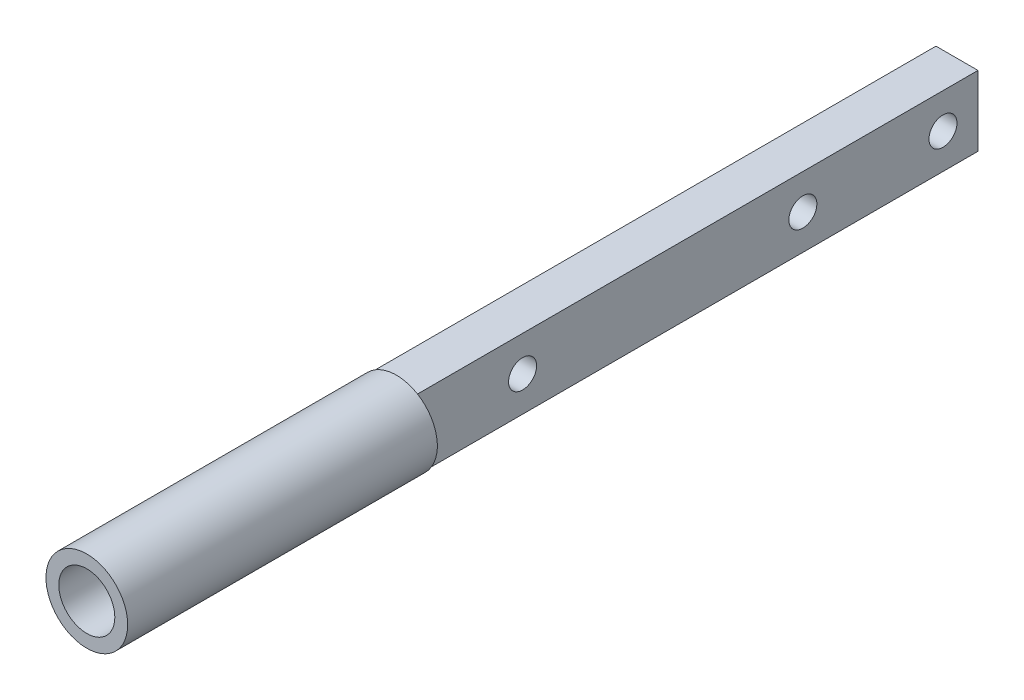
ISO-10303-21;
HEADER;
FILE_DESCRIPTION(('STEP AP214'),'2;1');
FILE_NAME('part.step','',(''),(''),'','','');
FILE_SCHEMA(('AUTOMOTIVE_DESIGN { 1 0 10303 214 1 1 1 1 }'));
ENDSEC;
DATA;
#1=APPLICATION_CONTEXT('core data for automotive mechanical design processes');
#2=APPLICATION_PROTOCOL_DEFINITION('international standard','automotive_design',2000,#1);
#3=PRODUCT_CONTEXT('',#1,'mechanical');
#4=PRODUCT('Part','Part','',(#3));
#5=PRODUCT_RELATED_PRODUCT_CATEGORY('part','',(#4));
#6=PRODUCT_DEFINITION_FORMATION('','',#4);
#7=PRODUCT_DEFINITION_CONTEXT('part definition',#1,'design');
#8=PRODUCT_DEFINITION('design','',#6,#7);
#9=PRODUCT_DEFINITION_SHAPE('','',#8);
#10=(LENGTH_UNIT() NAMED_UNIT(*) SI_UNIT(.MILLI.,.METRE.));
#11=(NAMED_UNIT(*) PLANE_ANGLE_UNIT() SI_UNIT($,.RADIAN.));
#12=(NAMED_UNIT(*) SI_UNIT($,.STERADIAN.) SOLID_ANGLE_UNIT());
#13=UNCERTAINTY_MEASURE_WITH_UNIT(LENGTH_MEASURE(1.E-05),#10,'distance_accuracy_value','');
#14=(GEOMETRIC_REPRESENTATION_CONTEXT(3) GLOBAL_UNCERTAINTY_ASSIGNED_CONTEXT((#13)) GLOBAL_UNIT_ASSIGNED_CONTEXT((#10,
#11,#12)) REPRESENTATION_CONTEXT('',''));
#15=CARTESIAN_POINT('',(0.,0.,0.));
#16=DIRECTION('',(0.,0.,1.));
#17=DIRECTION('',(1.,0.,0.));
#18=AXIS2_PLACEMENT_3D('',#15,#16,#17);
#19=CARTESIAN_POINT('',(-15.,25.,400.));
#20=DIRECTION('',(1.,0.,0.));
#21=DIRECTION('',(0.,1.,0.));
#22=AXIS2_PLACEMENT_3D('',#19,#20,#21);
#23=PLANE('',#22);
#24=CARTESIAN_POINT('',(-15.,0.,125.));
#25=DIRECTION('',(1.,0.,0.));
#26=DIRECTION('',(0.,1.,0.));
#27=AXIS2_PLACEMENT_3D('',#24,#25,#26);
#28=CIRCLE('',#27,9.99999999999999);
#29=CARTESIAN_POINT('',(-15.,9.99999999999998,125.));
#30=VERTEX_POINT('',#29);
#31=EDGE_CURVE('E130',#30,#30,#28,.F.);
#32=ORIENTED_EDGE('',*,*,#31,.F.);
#33=EDGE_LOOP('',(#32));
#34=FACE_BOUND('',#33,.T.);
#35=CARTESIAN_POINT('',(-15.,0.,325.));
#36=DIRECTION('',(1.,0.,0.));
#37=DIRECTION('',(0.,1.,0.));
#38=AXIS2_PLACEMENT_3D('',#35,#36,#37);
#39=CIRCLE('',#38,9.99999999999998);
#40=CARTESIAN_POINT('',(-15.,9.99999999999993,325.));
#41=VERTEX_POINT('',#40);
#42=EDGE_CURVE('E131',#41,#41,#39,.F.);
#43=ORIENTED_EDGE('',*,*,#42,.F.);
#44=EDGE_LOOP('',(#43));
#45=FACE_BOUND('',#44,.T.);
#46=CARTESIAN_POINT('',(-15.,0.,25.));
#47=DIRECTION('',(1.,0.,0.));
#48=DIRECTION('',(0.,1.,0.));
#49=AXIS2_PLACEMENT_3D('',#46,#47,#48);
#50=CIRCLE('',#49,10.);
#51=CARTESIAN_POINT('',(-15.,9.99999999999999,25.));
#52=VERTEX_POINT('',#51);
#53=EDGE_CURVE('E122',#52,#52,#50,.F.);
#54=ORIENTED_EDGE('',*,*,#53,.F.);
#55=EDGE_LOOP('',(#54));
#56=FACE_BOUND('',#55,.T.);
#57=DIRECTION('',(0.,-1.,0.));
#58=VECTOR('',#57,1.);
#59=CARTESIAN_POINT('',(-15.,25.,0.));
#60=LINE('',#59,#58);
#61=CARTESIAN_POINT('',(-15.,25.,0.));
#62=VERTEX_POINT('',#61);
#63=CARTESIAN_POINT('',(-15.,-25.,0.));
#64=VERTEX_POINT('',#63);
#65=EDGE_CURVE('E113',#62,#64,#60,.T.);
#66=ORIENTED_EDGE('',*,*,#65,.T.);
#67=DIRECTION('',(0.,0.,-1.));
#68=VECTOR('',#67,1.);
#69=CARTESIAN_POINT('',(-15.,-25.,400.));
#70=LINE('',#69,#68);
#71=CARTESIAN_POINT('',(-15.,-25.,400.));
#72=VERTEX_POINT('',#71);
#73=EDGE_CURVE('E11',#72,#64,#70,.T.);
#74=ORIENTED_EDGE('',*,*,#73,.F.);
#75=DIRECTION('',(0.,-1.,0.));
#76=VECTOR('',#75,1.);
#77=CARTESIAN_POINT('',(-15.,25.,400.));
#78=LINE('',#77,#76);
#79=CARTESIAN_POINT('',(-15.,25.,400.));
#80=VERTEX_POINT('',#79);
#81=EDGE_CURVE('E80',#80,#72,#78,.T.);
#82=ORIENTED_EDGE('',*,*,#81,.F.);
#83=DIRECTION('',(0.,0.,-1.));
#84=VECTOR('',#83,1.);
#85=CARTESIAN_POINT('',(-15.,25.,400.));
#86=LINE('',#85,#84);
#87=EDGE_CURVE('E82',#80,#62,#86,.T.);
#88=ORIENTED_EDGE('',*,*,#87,.T.);
#89=EDGE_LOOP('',(#66,#74,#82,#88));
#90=FACE_BOUND('',#89,.T.);
#91=ADVANCED_FACE('F32',(#34,#45,#56,#90),#23,.F.);
#92=CARTESIAN_POINT('',(-15.,-25.,400.));
#93=DIRECTION('',(0.,1.,0.));
#94=DIRECTION('',(0.,0.,1.));
#95=AXIS2_PLACEMENT_3D('',#92,#93,#94);
#96=PLANE('',#95);
#97=DIRECTION('',(1.,0.,0.));
#98=VECTOR('',#97,1.);
#99=CARTESIAN_POINT('',(-15.,-25.,0.));
#100=LINE('',#99,#98);
#101=CARTESIAN_POINT('',(15.,-25.,0.));
#102=VERTEX_POINT('',#101);
#103=EDGE_CURVE('E303',#64,#102,#100,.T.);
#104=ORIENTED_EDGE('',*,*,#103,.T.);
#105=DIRECTION('',(0.,0.,-1.));
#106=VECTOR('',#105,1.);
#107=CARTESIAN_POINT('',(15.,-25.,400.));
#108=LINE('',#107,#106);
#109=CARTESIAN_POINT('',(15.,-25.,400.));
#110=VERTEX_POINT('',#109);
#111=EDGE_CURVE('E40',#110,#102,#108,.T.);
#112=ORIENTED_EDGE('',*,*,#111,.F.);
#113=DIRECTION('',(1.,0.,0.));
#114=VECTOR('',#113,1.);
#115=CARTESIAN_POINT('',(-15.,-25.,400.));
#116=LINE('',#115,#114);
#117=EDGE_CURVE('E74',#72,#110,#116,.T.);
#118=ORIENTED_EDGE('',*,*,#117,.F.);
#119=ORIENTED_EDGE('',*,*,#73,.T.);
#120=EDGE_LOOP('',(#104,#112,#118,#119));
#121=FACE_BOUND('',#120,.T.);
#122=ADVANCED_FACE('F149',(#121),#96,.F.);
#123=CARTESIAN_POINT('',(15.,25.,400.));
#124=DIRECTION('',(-1.,0.,0.));
#125=DIRECTION('',(0.,-1.,0.));
#126=AXIS2_PLACEMENT_3D('',#123,#124,#125);
#127=PLANE('',#126);
#128=CARTESIAN_POINT('',(15.,0.,125.));
#129=DIRECTION('',(1.,0.,0.));
#130=DIRECTION('',(0.,1.,0.));
#131=AXIS2_PLACEMENT_3D('',#128,#129,#130);
#132=CIRCLE('',#131,9.99999999999999);
#133=CARTESIAN_POINT('',(15.,9.99999999999998,125.));
#134=VERTEX_POINT('',#133);
#135=EDGE_CURVE('E134',#134,#134,#132,.T.);
#136=ORIENTED_EDGE('',*,*,#135,.F.);
#137=EDGE_LOOP('',(#136));
#138=FACE_BOUND('',#137,.T.);
#139=CARTESIAN_POINT('',(15.,0.,325.));
#140=DIRECTION('',(1.,0.,0.));
#141=DIRECTION('',(0.,1.,0.));
#142=AXIS2_PLACEMENT_3D('',#139,#140,#141);
#143=CIRCLE('',#142,9.99999999999998);
#144=CARTESIAN_POINT('',(15.,9.99999999999994,325.));
#145=VERTEX_POINT('',#144);
#146=EDGE_CURVE('E135',#145,#145,#143,.T.);
#147=ORIENTED_EDGE('',*,*,#146,.F.);
#148=EDGE_LOOP('',(#147));
#149=FACE_BOUND('',#148,.T.);
#150=CARTESIAN_POINT('',(15.,0.,25.));
#151=DIRECTION('',(1.,0.,0.));
#152=DIRECTION('',(0.,1.,0.));
#153=AXIS2_PLACEMENT_3D('',#150,#151,#152);
#154=CIRCLE('',#153,10.);
#155=CARTESIAN_POINT('',(15.,10.,25.));
#156=VERTEX_POINT('',#155);
#157=EDGE_CURVE('E127',#156,#156,#154,.T.);
#158=ORIENTED_EDGE('',*,*,#157,.F.);
#159=EDGE_LOOP('',(#158));
#160=FACE_BOUND('',#159,.T.);
#161=DIRECTION('',(0.,1.,0.));
#162=VECTOR('',#161,1.);
#163=CARTESIAN_POINT('',(15.,25.,0.));
#164=LINE('',#163,#162);
#165=CARTESIAN_POINT('',(15.,25.,0.));
#166=VERTEX_POINT('',#165);
#167=EDGE_CURVE('E64',#102,#166,#164,.T.);
#168=ORIENTED_EDGE('',*,*,#167,.T.);
#169=DIRECTION('',(0.,0.,-1.));
#170=VECTOR('',#169,1.);
#171=CARTESIAN_POINT('',(15.,25.,400.));
#172=LINE('',#171,#170);
#173=CARTESIAN_POINT('',(15.,25.,400.));
#174=VERTEX_POINT('',#173);
#175=EDGE_CURVE('E48',#174,#166,#172,.T.);
#176=ORIENTED_EDGE('',*,*,#175,.F.);
#177=DIRECTION('',(0.,1.,0.));
#178=VECTOR('',#177,1.);
#179=CARTESIAN_POINT('',(15.,25.,400.));
#180=LINE('',#179,#178);
#181=EDGE_CURVE('E98',#110,#174,#180,.T.);
#182=ORIENTED_EDGE('',*,*,#181,.F.);
#183=ORIENTED_EDGE('',*,*,#111,.T.);
#184=EDGE_LOOP('',(#168,#176,#182,#183));
#185=FACE_BOUND('',#184,.T.);
#186=ADVANCED_FACE('F146',(#138,#149,#160,#185),#127,.F.);
#187=CARTESIAN_POINT('',(-15.,25.,400.));
#188=DIRECTION('',(0.,-1.,0.));
#189=DIRECTION('',(0.,0.,-1.));
#190=AXIS2_PLACEMENT_3D('',#187,#188,#189);
#191=PLANE('',#190);
#192=DIRECTION('',(-1.,0.,0.));
#193=VECTOR('',#192,1.);
#194=CARTESIAN_POINT('',(-15.,25.,0.));
#195=LINE('',#194,#193);
#196=EDGE_CURVE('E69',#166,#62,#195,.T.);
#197=ORIENTED_EDGE('',*,*,#196,.T.);
#198=ORIENTED_EDGE('',*,*,#87,.F.);
#199=DIRECTION('',(-1.,0.,0.));
#200=VECTOR('',#199,1.);
#201=CARTESIAN_POINT('',(-15.,25.,400.));
#202=LINE('',#201,#200);
#203=EDGE_CURVE('E90',#174,#80,#202,.T.);
#204=ORIENTED_EDGE('',*,*,#203,.F.);
#205=ORIENTED_EDGE('',*,*,#175,.T.);
#206=EDGE_LOOP('',(#197,#198,#204,#205));
#207=FACE_BOUND('',#206,.T.);
#208=ADVANCED_FACE('F89',(#207),#191,.F.);
#209=CARTESIAN_POINT('',(0.,0.,0.));
#210=DIRECTION('',(0.,0.,1.));
#211=DIRECTION('',(1.,0.,0.));
#212=AXIS2_PLACEMENT_3D('',#209,#210,#211);
#213=PLANE('',#212);
#214=ORIENTED_EDGE('',*,*,#65,.F.);
#215=ORIENTED_EDGE('',*,*,#196,.F.);
#216=ORIENTED_EDGE('',*,*,#167,.F.);
#217=ORIENTED_EDGE('',*,*,#103,.F.);
#218=EDGE_LOOP('',(#214,#215,#216,#217));
#219=FACE_BOUND('',#218,.T.);
#220=ADVANCED_FACE('F196',(#219),#213,.F.);
#221=CARTESIAN_POINT('',(0.,0.,400.));
#222=DIRECTION('',(0.,0.,1.));
#223=DIRECTION('',(1.,0.,0.));
#224=AXIS2_PLACEMENT_3D('',#221,#222,#223);
#225=PLANE('',#224);
#226=CARTESIAN_POINT('',(0.,0.,400.));
#227=DIRECTION('',(0.,0.,1.));
#228=DIRECTION('',(1.,0.,0.));
#229=AXIS2_PLACEMENT_3D('',#226,#227,#228);
#230=CIRCLE('',#229,29.1547594742265);
#231=EDGE_CURVE('E101',#80,#72,#230,.T.);
#232=ORIENTED_EDGE('',*,*,#231,.F.);
#233=ORIENTED_EDGE('',*,*,#81,.T.);
#234=EDGE_LOOP('',(#232,#233));
#235=FACE_BOUND('',#234,.T.);
#236=ADVANCED_FACE('F102',(#235),#225,.F.);
#237=EDGE_CURVE('E105',#72,#110,#230,.T.);
#238=ORIENTED_EDGE('',*,*,#237,.F.);
#239=ORIENTED_EDGE('',*,*,#117,.T.);
#240=EDGE_LOOP('',(#238,#239));
#241=FACE_BOUND('',#240,.T.);
#242=ADVANCED_FACE('F216',(#241),#225,.F.);
#243=EDGE_CURVE('E110',#110,#174,#230,.T.);
#244=ORIENTED_EDGE('',*,*,#243,.F.);
#245=ORIENTED_EDGE('',*,*,#181,.T.);
#246=EDGE_LOOP('',(#244,#245));
#247=FACE_BOUND('',#246,.T.);
#248=ADVANCED_FACE('F192',(#247),#225,.F.);
#249=CARTESIAN_POINT('',(0.,0.,621.));
#250=DIRECTION('',(0.,0.,-1.));
#251=DIRECTION('',(-1.,0.,0.));
#252=AXIS2_PLACEMENT_3D('',#249,#250,#251);
#253=CYLINDRICAL_SURFACE('',#252,29.1547594742265);
#254=CARTESIAN_POINT('',(0.,0.,621.));
#255=DIRECTION('',(0.,0.,1.));
#256=DIRECTION('',(1.,0.,0.));
#257=AXIS2_PLACEMENT_3D('',#254,#255,#256);
#258=CIRCLE('',#257,29.1547594742265);
#259=CARTESIAN_POINT('',(29.1547594742265,0.,621.));
#260=VERTEX_POINT('',#259);
#261=EDGE_CURVE('E111',#260,#260,#258,.T.);
#262=ORIENTED_EDGE('',*,*,#261,.F.);
#263=EDGE_LOOP('',(#262));
#264=FACE_BOUND('',#263,.T.);
#265=EDGE_CURVE('E97',#174,#80,#230,.T.);
#266=ORIENTED_EDGE('',*,*,#265,.T.);
#267=ORIENTED_EDGE('',*,*,#231,.T.);
#268=ORIENTED_EDGE('',*,*,#237,.T.);
#269=ORIENTED_EDGE('',*,*,#243,.T.);
#270=EDGE_LOOP('',(#266,#267,#268,#269));
#271=FACE_BOUND('',#270,.T.);
#272=ADVANCED_FACE('F108',(#264,#271),#253,.T.);
#273=CARTESIAN_POINT('',(0.,0.,621.));
#274=DIRECTION('',(0.,0.,1.));
#275=DIRECTION('',(1.,0.,0.));
#276=AXIS2_PLACEMENT_3D('',#273,#274,#275);
#277=PLANE('',#276);
#278=CARTESIAN_POINT('',(0.,0.,621.));
#279=DIRECTION('',(0.,0.,1.));
#280=DIRECTION('',(1.,0.,0.));
#281=AXIS2_PLACEMENT_3D('',#278,#279,#280);
#282=CIRCLE('',#281,20.);
#283=CARTESIAN_POINT('',(20.,0.,621.));
#284=VERTEX_POINT('',#283);
#285=EDGE_CURVE('E117',#284,#284,#282,.T.);
#286=ORIENTED_EDGE('',*,*,#285,.F.);
#287=EDGE_LOOP('',(#286));
#288=FACE_BOUND('',#287,.T.);
#289=ORIENTED_EDGE('',*,*,#261,.T.);
#290=EDGE_LOOP('',(#289));
#291=FACE_BOUND('',#290,.T.);
#292=ADVANCED_FACE('F186',(#288,#291),#277,.T.);
#293=ORIENTED_EDGE('',*,*,#265,.F.);
#294=ORIENTED_EDGE('',*,*,#203,.T.);
#295=EDGE_LOOP('',(#293,#294));
#296=FACE_BOUND('',#295,.T.);
#297=ADVANCED_FACE('F95',(#296),#225,.F.);
#298=CARTESIAN_POINT('',(0.,0.,426.));
#299=DIRECTION('',(0.,0.,1.));
#300=DIRECTION('',(1.,0.,0.));
#301=AXIS2_PLACEMENT_3D('',#298,#299,#300);
#302=CYLINDRICAL_SURFACE('',#301,20.);
#303=CARTESIAN_POINT('',(0.,0.,426.));
#304=DIRECTION('',(0.,0.,1.));
#305=DIRECTION('',(1.,0.,0.));
#306=AXIS2_PLACEMENT_3D('',#303,#304,#305);
#307=CIRCLE('',#306,20.);
#308=CARTESIAN_POINT('',(20.,0.,426.));
#309=VERTEX_POINT('',#308);
#310=EDGE_CURVE('E115',#309,#309,#307,.T.);
#311=ORIENTED_EDGE('',*,*,#310,.F.);
#312=EDGE_LOOP('',(#311));
#313=FACE_BOUND('',#312,.T.);
#314=ORIENTED_EDGE('',*,*,#285,.T.);
#315=EDGE_LOOP('',(#314));
#316=FACE_BOUND('',#315,.T.);
#317=ADVANCED_FACE('F182',(#313,#316),#302,.F.);
#318=CARTESIAN_POINT('',(0.,0.,426.));
#319=DIRECTION('',(0.,0.,1.));
#320=DIRECTION('',(1.,0.,0.));
#321=AXIS2_PLACEMENT_3D('',#318,#319,#320);
#322=PLANE('',#321);
#323=ORIENTED_EDGE('',*,*,#310,.T.);
#324=EDGE_LOOP('',(#323));
#325=FACE_BOUND('',#324,.T.);
#326=ADVANCED_FACE('F159',(#325),#322,.T.);
#327=CARTESIAN_POINT('',(-29.1557594742265,0.,25.));
#328=DIRECTION('',(1.,0.,0.));
#329=DIRECTION('',(0.,1.,0.));
#330=AXIS2_PLACEMENT_3D('',#327,#328,#329);
#331=CYLINDRICAL_SURFACE('',#330,10.);
#332=ORIENTED_EDGE('',*,*,#157,.T.);
#333=EDGE_LOOP('',(#332));
#334=FACE_BOUND('',#333,.T.);
#335=ORIENTED_EDGE('',*,*,#53,.T.);
#336=EDGE_LOOP('',(#335));
#337=FACE_BOUND('',#336,.T.);
#338=ADVANCED_FACE('F155',(#334,#337),#331,.F.);
#339=CARTESIAN_POINT('',(-29.1557594742265,0.,325.));
#340=DIRECTION('',(1.,0.,0.));
#341=DIRECTION('',(0.,1.,0.));
#342=AXIS2_PLACEMENT_3D('',#339,#340,#341);
#343=CYLINDRICAL_SURFACE('',#342,9.99999999999998);
#344=ORIENTED_EDGE('',*,*,#146,.T.);
#345=EDGE_LOOP('',(#344));
#346=FACE_BOUND('',#345,.T.);
#347=ORIENTED_EDGE('',*,*,#42,.T.);
#348=EDGE_LOOP('',(#347));
#349=FACE_BOUND('',#348,.T.);
#350=ADVANCED_FACE('F158',(#346,#349),#343,.F.);
#351=CARTESIAN_POINT('',(-29.1557594742265,0.,125.));
#352=DIRECTION('',(1.,0.,0.));
#353=DIRECTION('',(0.,1.,0.));
#354=AXIS2_PLACEMENT_3D('',#351,#352,#353);
#355=CYLINDRICAL_SURFACE('',#354,9.99999999999999);
#356=ORIENTED_EDGE('',*,*,#135,.T.);
#357=EDGE_LOOP('',(#356));
#358=FACE_BOUND('',#357,.T.);
#359=ORIENTED_EDGE('',*,*,#31,.T.);
#360=EDGE_LOOP('',(#359));
#361=FACE_BOUND('',#360,.T.);
#362=ADVANCED_FACE('F143',(#358,#361),#355,.F.);
#363=CLOSED_SHELL('',(#91,#122,#186,#208,#220,#236,#242,#248,#272,#292,#297,#317,#326,#338,#350,#362));
#364=MANIFOLD_SOLID_BREP('B2',#363);
#365=ADVANCED_BREP_SHAPE_REPRESENTATION('',(#18,#364),#14);
#366=SHAPE_DEFINITION_REPRESENTATION(#9,#365);
ENDSEC;
END-ISO-10303-21;
